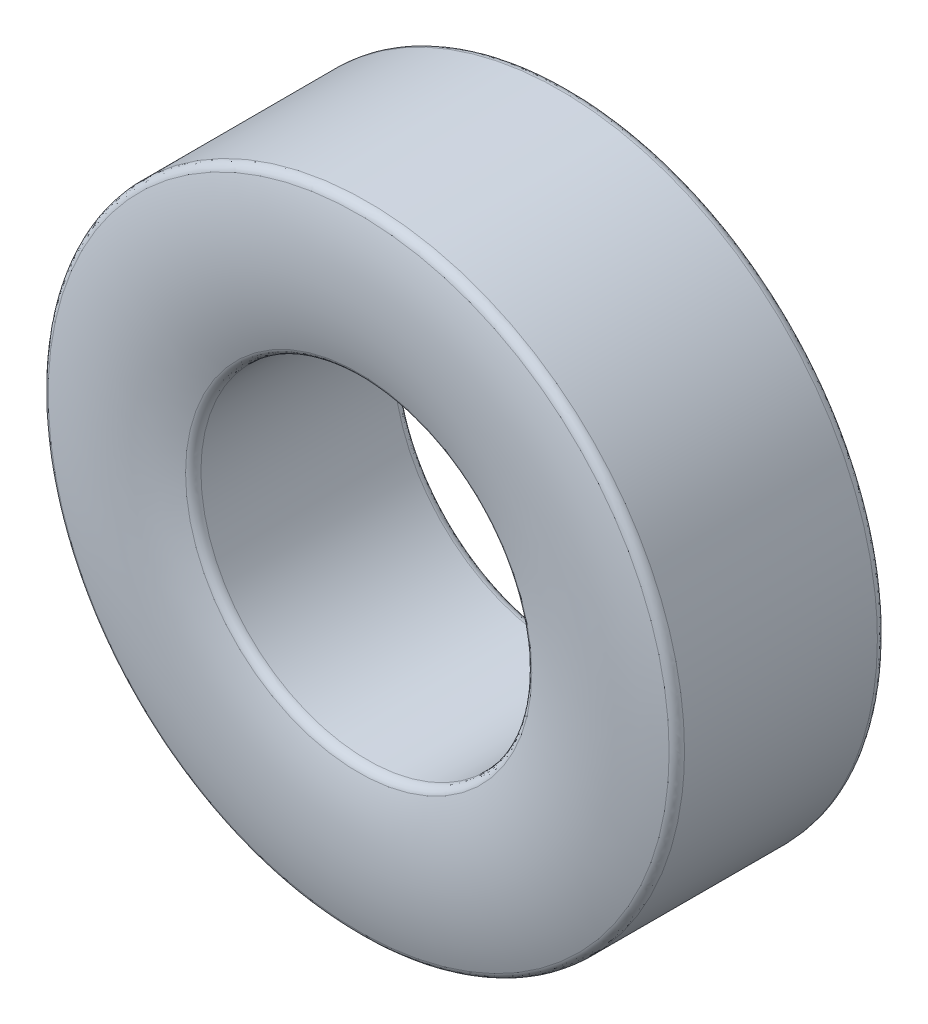
ISO-10303-21;
HEADER;
FILE_DESCRIPTION(('STEP AP214'),'2;1');
FILE_NAME('part.step','',(''),(''),'','','');
FILE_SCHEMA(('AUTOMOTIVE_DESIGN { 1 0 10303 214 1 1 1 1 }'));
ENDSEC;
DATA;
#1=APPLICATION_CONTEXT('core data for automotive mechanical design processes');
#2=APPLICATION_PROTOCOL_DEFINITION('international standard','automotive_design',2000,#1);
#3=PRODUCT_CONTEXT('',#1,'mechanical');
#4=PRODUCT('Part','Part','',(#3));
#5=PRODUCT_RELATED_PRODUCT_CATEGORY('part','',(#4));
#6=PRODUCT_DEFINITION_FORMATION('','',#4);
#7=PRODUCT_DEFINITION_CONTEXT('part definition',#1,'design');
#8=PRODUCT_DEFINITION('design','',#6,#7);
#9=PRODUCT_DEFINITION_SHAPE('','',#8);
#10=(LENGTH_UNIT() NAMED_UNIT(*) SI_UNIT(.MILLI.,.METRE.));
#11=(NAMED_UNIT(*) PLANE_ANGLE_UNIT() SI_UNIT($,.RADIAN.));
#12=(NAMED_UNIT(*) SI_UNIT($,.STERADIAN.) SOLID_ANGLE_UNIT());
#13=UNCERTAINTY_MEASURE_WITH_UNIT(LENGTH_MEASURE(1.E-05),#10,'distance_accuracy_value','');
#14=(GEOMETRIC_REPRESENTATION_CONTEXT(3) GLOBAL_UNCERTAINTY_ASSIGNED_CONTEXT((#13)) GLOBAL_UNIT_ASSIGNED_CONTEXT((#10,
#11,#12)) REPRESENTATION_CONTEXT('',''));
#15=CARTESIAN_POINT('',(0.,0.,0.));
#16=DIRECTION('',(0.,0.,1.));
#17=DIRECTION('',(1.,0.,0.));
#18=AXIS2_PLACEMENT_3D('',#15,#16,#17);
#19=CARTESIAN_POINT('',(41.4,17.7,22.357140159689));
#20=DIRECTION('',(0.,0.,-1.));
#21=DIRECTION('',(0.,1.,0.));
#22=AXIS2_PLACEMENT_3D('',#19,#20,#21);
#23=CYLINDRICAL_SURFACE('',#22,7.2);
#24=CARTESIAN_POINT('',(48.6,17.7,22.067196954359));
#25=CARTESIAN_POINT('',(48.6,14.515391342823,22.067196954359));
#26=CARTESIAN_POINT('',(47.083334745164,11.26299240056,22.067196954358));
#27=CARTESIAN_POINT('',(43.943052554538,8.790517808086,22.067196954359));
#28=CARTESIAN_POINT('',(39.65993358668,7.97768574266,22.067196954358));
#29=CARTESIAN_POINT('',(35.223114975667,9.586618152221,22.06719695436));
#30=CARTESIAN_POINT('',(32.246731902476,12.772196186467,22.067196954356));
#31=CARTESIAN_POINT('',(30.363843158455,17.6999999999,22.067196954361));
#32=CARTESIAN_POINT('',(32.246731902493,22.627803813708,22.067196954357));
#33=CARTESIAN_POINT('',(35.22311497565,25.813381847662,22.067196954359));
#34=CARTESIAN_POINT('',(39.659933586685,27.422314257403,22.067196954358));
#35=CARTESIAN_POINT('',(43.943052554541,26.609482191885,22.067196954359));
#36=CARTESIAN_POINT('',(47.08333474516,24.137007599452,22.067196954358));
#37=CARTESIAN_POINT('',(48.600000000001,20.884608657174,22.067196954359));
#38=CARTESIAN_POINT('',(48.6,17.7,22.067196954359));
#39=(BOUNDED_CURVE() B_SPLINE_CURVE(14,(#24,#25,#26,#27,#28,#29,#30,#31,#32,#33,#34,#35,#36,#37,
#38),.UNSPECIFIED.,.T.,.F.) B_SPLINE_CURVE_WITH_KNOTS((15,15),(0.,45.238934211693),
.UNSPECIFIED.) CURVE() GEOMETRIC_REPRESENTATION_ITEM() RATIONAL_B_SPLINE_CURVE((1.,1.,
0.999999999999,1.000000000001,0.999999999998,1.000000000003,0.999999999998,1.000000000001,
0.999999999999,1.,1.,1.,1.,1.,1.)) REPRESENTATION_ITEM(''));
#40=CARTESIAN_POINT('',(48.6,17.7,22.067196954359));
#41=VERTEX_POINT('',#40);
#42=EDGE_CURVE('E54',#41,#41,#39,.T.);
#43=ORIENTED_EDGE('',*,*,#42,.F.);
#44=EDGE_LOOP('',(#43));
#45=FACE_BOUND('',#44,.T.);
#46=CARTESIAN_POINT('',(48.6,17.7,13.732803045641));
#47=CARTESIAN_POINT('',(48.600000000004,20.884608657176,13.732803045641));
#48=CARTESIAN_POINT('',(47.083334745148,24.13700759944,13.732803045641));
#49=CARTESIAN_POINT('',(43.943052554562,26.609482191929,13.732803045641));
#50=CARTESIAN_POINT('',(39.659933586679,27.4223142573,13.732803045642));
#51=CARTESIAN_POINT('',(35.223114975597,25.81338184782,13.732803045641));
#52=CARTESIAN_POINT('',(32.246731902622,22.627803813541,13.732803045642));
#53=CARTESIAN_POINT('',(30.363843158271,17.699999999992,13.732803045641));
#54=CARTESIAN_POINT('',(32.246731902608,12.772196186473,13.732803045642));
#55=CARTESIAN_POINT('',(35.223114975616,9.586618152168,13.732803045641));
#56=CARTESIAN_POINT('',(39.659933586666,7.977685742708,13.732803045642));
#57=CARTESIAN_POINT('',(43.943052554566,8.790517808067,13.732803045641));
#58=CARTESIAN_POINT('',(47.083334745148,11.262992400562,13.732803045642));
#59=CARTESIAN_POINT('',(48.600000000005,14.515391342823,13.732803045641));
#60=CARTESIAN_POINT('',(48.6,17.7,13.732803045641));
#61=(BOUNDED_CURVE() B_SPLINE_CURVE(14,(#46,#47,#48,#49,#50,#51,#52,#53,#54,#55,#56,#57,#58,#59,
#60),.UNSPECIFIED.,.T.,.F.) B_SPLINE_CURVE_WITH_KNOTS((15,15),(0.,45.238934211693),
.UNSPECIFIED.) CURVE() GEOMETRIC_REPRESENTATION_ITEM() RATIONAL_B_SPLINE_CURVE((1.,1.,
1.000000000001,0.999999999996,1.000000000008,0.999999999987,1.000000000018,0.999999999981,
1.000000000017,0.999999999987,1.000000000007,0.999999999997,1.000000000001,1.,1.)) REPRESENTATION_ITEM(''));
#62=CARTESIAN_POINT('',(48.6,17.7,13.732803045641));
#63=VERTEX_POINT('',#62);
#64=EDGE_CURVE('E49',#63,#63,#61,.T.);
#65=ORIENTED_EDGE('',*,*,#64,.F.);
#66=EDGE_LOOP('',(#65));
#67=FACE_BOUND('',#66,.T.);
#68=ADVANCED_FACE('F15',(#45,#67),#23,.F.);
#69=CARTESIAN_POINT('',(48.88125,17.7,22.449163494123));
#70=CARTESIAN_POINT('',(48.88125,14.390992567152,22.449163494123));
#71=CARTESIAN_POINT('',(47.305340008648,11.011546791207,22.449163494124));
#72=CARTESIAN_POINT('',(44.042390544944,8.442491159962,22.449163494123));
#73=CARTESIAN_POINT('',(39.591962242421,7.597907841988,22.449163494124));
#74=CARTESIAN_POINT('',(34.981830404384,9.269689173783,22.449163494122));
#75=CARTESIAN_POINT('',(31.889182367445,12.579703850013,22.449163494125));
#76=CARTESIAN_POINT('',(29.9327432818,17.699999999883,22.449163494122));
#77=CARTESIAN_POINT('',(31.889182367463,22.820296150192,22.449163494125));
#78=CARTESIAN_POINT('',(34.981830404365,26.130310826078,22.449163494122));
#79=CARTESIAN_POINT('',(39.591962242427,27.802092158087,22.449163494124));
#80=CARTESIAN_POINT('',(44.042390544947,26.957508840003,22.449163494123));
#81=CARTESIAN_POINT('',(47.305340008645,24.388453208806,22.449163494124));
#82=CARTESIAN_POINT('',(48.881250000001,21.009007432845,22.449163494123));
#83=CARTESIAN_POINT('',(48.88125,17.7,22.449163494123));
#84=CARTESIAN_POINT('',(48.6,17.7,22.361725370563));
#85=CARTESIAN_POINT('',(48.600000000001,14.515391342824,22.361725370563));
#86=CARTESIAN_POINT('',(47.08333474516,11.262992400557,22.361725370563));
#87=CARTESIAN_POINT('',(43.943052554545,8.790517808091,22.361725370563));
#88=CARTESIAN_POINT('',(39.659933586675,7.977685742652,22.361725370563));
#89=CARTESIAN_POINT('',(35.223114975656,9.58661815224,22.361725370563));
#90=CARTESIAN_POINT('',(32.246731902512,12.77219618642,22.361725370562));
#91=CARTESIAN_POINT('',(30.3638431584,17.69999999999,22.361725370563));
#92=CARTESIAN_POINT('',(32.246731902531,22.627803813586,22.361725370563));
#93=CARTESIAN_POINT('',(35.223114975638,25.813381847775,22.361725370562));
#94=CARTESIAN_POINT('',(39.659933586676,27.422314257325,22.361725370563));
#95=CARTESIAN_POINT('',(43.943052554553,26.609482191922,22.361725370563));
#96=CARTESIAN_POINT('',(47.083334745154,24.13700759944,22.361725370563));
#97=CARTESIAN_POINT('',(48.600000000003,20.884608657176,22.361725370563));
#98=CARTESIAN_POINT('',(48.6,17.7,22.361725370563));
#99=CARTESIAN_POINT('',(48.6,17.7,22.067196954359));
#100=CARTESIAN_POINT('',(48.6,14.515391342823,22.067196954359));
#101=CARTESIAN_POINT('',(47.083334745164,11.26299240056,22.067196954358));
#102=CARTESIAN_POINT('',(43.943052554538,8.790517808086,22.067196954359));
#103=CARTESIAN_POINT('',(39.65993358668,7.97768574266,22.067196954358));
#104=CARTESIAN_POINT('',(35.223114975667,9.586618152221,22.06719695436));
#105=CARTESIAN_POINT('',(32.246731902476,12.772196186467,22.067196954356));
#106=CARTESIAN_POINT('',(30.363843158455,17.6999999999,22.067196954361));
#107=CARTESIAN_POINT('',(32.246731902493,22.627803813708,22.067196954357));
#108=CARTESIAN_POINT('',(35.22311497565,25.813381847662,22.067196954359));
#109=CARTESIAN_POINT('',(39.659933586685,27.422314257403,22.067196954358));
#110=CARTESIAN_POINT('',(43.943052554541,26.609482191885,22.067196954359));
#111=CARTESIAN_POINT('',(47.08333474516,24.137007599452,22.067196954358));
#112=CARTESIAN_POINT('',(48.600000000001,20.884608657174,22.067196954359));
#113=CARTESIAN_POINT('',(48.6,17.7,22.067196954359));
#114=(BOUNDED_SURFACE() B_SPLINE_SURFACE(2,14,((#69,#70,#71,#72,#73,#74,#75,#76,#77,#78,#79,#80,
#81,#82,#83),(#84,#85,#86,#87,#88,#89,#90,#91,#92,#93,#94,#95,#96,#97,#98),(#99,#100,#101,#102,
#103,#104,#105,#106,#107,#108,#109,#110,#111,#112,#113)),.UNSPECIFIED.,.F.,.T.,
.F.) B_SPLINE_SURFACE_WITH_KNOTS((3,3),(15,15),(0.,45.238934211693),(0.,45.238934211693),
.UNSPECIFIED.) GEOMETRIC_REPRESENTATION_ITEM() RATIONAL_B_SPLINE_SURFACE(((1.,1.,0.999999999999,
1.000000000001,0.999999999998,1.000000000003,0.999999999998,1.000000000001,0.999999999999,1.,1.,
1.,1.,1.,1.),(0.80525617042,0.80525617042,0.80525617042,0.805256170421,0.805256170421,
0.805256170419,0.805256170424,0.805256170415,0.805256170426,0.805256170416,0.805256170423,
0.805256170419,0.805256170421,0.80525617042,0.80525617042),(1.,1.,0.999999999999,1.000000000001,
0.999999999998,1.000000000003,0.999999999998,1.000000000001,0.999999999999,1.,1.,1.,1.,1.,1.))) REPRESENTATION_ITEM('') SURFACE());
#115=CARTESIAN_POINT('',(41.4,17.7,22.4491634941234));
#116=DIRECTION('',(0.,0.,-1.));
#117=DIRECTION('',(1.,0.,0.));
#118=AXIS2_PLACEMENT_3D('',#115,#116,#117);
#119=CIRCLE('',#118,7.48124999999987);
#120=CARTESIAN_POINT('',(48.8812499999999,17.7,22.4491634941234));
#121=VERTEX_POINT('',#120);
#122=EDGE_CURVE('E44',#121,#121,#119,.T.);
#123=ORIENTED_EDGE('',*,*,#42,.T.);
#124=EDGE_LOOP('',(#123));
#125=FACE_BOUND('',#124,.T.);
#126=ORIENTED_EDGE('',*,*,#122,.F.);
#127=EDGE_LOOP('',(#126));
#128=FACE_BOUND('',#127,.T.);
#129=ADVANCED_FACE('F62',(#125,#128),#114,.T.);
#130=CARTESIAN_POINT('',(48.6,17.7,13.732803045641));
#131=CARTESIAN_POINT('',(48.600000000005,14.515391342823,13.732803045641));
#132=CARTESIAN_POINT('',(47.083334745148,11.262992400562,13.732803045642));
#133=CARTESIAN_POINT('',(43.943052554566,8.790517808067,13.732803045641));
#134=CARTESIAN_POINT('',(39.659933586666,7.977685742708,13.732803045642));
#135=CARTESIAN_POINT('',(35.223114975616,9.586618152168,13.732803045641));
#136=CARTESIAN_POINT('',(32.246731902608,12.772196186473,13.732803045642));
#137=CARTESIAN_POINT('',(30.363843158271,17.699999999992,13.732803045641));
#138=CARTESIAN_POINT('',(32.246731902622,22.627803813541,13.732803045642));
#139=CARTESIAN_POINT('',(35.223114975597,25.81338184782,13.732803045641));
#140=CARTESIAN_POINT('',(39.659933586679,27.4223142573,13.732803045642));
#141=CARTESIAN_POINT('',(43.943052554562,26.609482191929,13.732803045641));
#142=CARTESIAN_POINT('',(47.083334745148,24.13700759944,13.732803045641));
#143=CARTESIAN_POINT('',(48.600000000004,20.884608657176,13.732803045641));
#144=CARTESIAN_POINT('',(48.6,17.7,13.732803045641));
#145=CARTESIAN_POINT('',(48.6,17.7,13.438274629437));
#146=CARTESIAN_POINT('',(48.600000000005,14.515391342823,13.438274629437));
#147=CARTESIAN_POINT('',(47.083334745147,11.262992400563,13.438274629437));
#148=CARTESIAN_POINT('',(43.943052554568,8.790517808064,13.438274629437));
#149=CARTESIAN_POINT('',(39.659933586666,7.977685742713,13.438274629437));
#150=CARTESIAN_POINT('',(35.223114975611,9.586618152163,13.438274629437));
#151=CARTESIAN_POINT('',(32.246731902618,12.772196186473,13.438274629437));
#152=CARTESIAN_POINT('',(30.363843158258,17.700000000004,13.438274629438));
#153=CARTESIAN_POINT('',(32.246731902628,22.627803813522,13.438274629437));
#154=CARTESIAN_POINT('',(35.223114975598,25.813381847838,13.438274629437));
#155=CARTESIAN_POINT('',(39.659933586674,27.422314257289,13.438274629437));
#156=CARTESIAN_POINT('',(43.943052554565,26.609482191933,13.438274629437));
#157=CARTESIAN_POINT('',(47.083334745147,24.137007599439,13.438274629437));
#158=CARTESIAN_POINT('',(48.600000000005,20.884608657176,13.438274629437));
#159=CARTESIAN_POINT('',(48.6,17.7,13.438274629437));
#160=CARTESIAN_POINT('',(48.88125,17.7,13.350836505877));
#161=CARTESIAN_POINT('',(48.881250000005,14.390992567153,13.350836505877));
#162=CARTESIAN_POINT('',(47.30534000863,11.011546791207,13.350836505877));
#163=CARTESIAN_POINT('',(44.04239054498,8.442491159952,13.350836505877));
#164=CARTESIAN_POINT('',(39.591962242392,7.597907842018,13.350836505876));
#165=CARTESIAN_POINT('',(34.981830404359,9.269689173759,13.350836505877));
#166=CARTESIAN_POINT('',(31.889182367541,12.579703849981,13.350836505876));
#167=CARTESIAN_POINT('',(29.932743281657,17.70000000002,13.350836505877));
#168=CARTESIAN_POINT('',(31.889182367553,22.820296149983,13.350836505876));
#169=CARTESIAN_POINT('',(34.981830404344,26.130310826269,13.350836505877));
#170=CARTESIAN_POINT('',(39.5919622424,27.802092157964,13.350836505876));
#171=CARTESIAN_POINT('',(44.042390544979,26.957508840056,13.350836505877));
#172=CARTESIAN_POINT('',(47.305340008629,24.388453208791,13.350836505877));
#173=CARTESIAN_POINT('',(48.881250000005,21.009007432847,13.350836505877));
#174=CARTESIAN_POINT('',(48.88125,17.7,13.350836505877));
#175=(BOUNDED_SURFACE() B_SPLINE_SURFACE(2,14,((#130,#131,#132,#133,#134,#135,#136,#137,#138,
#139,#140,#141,#142,#143,#144),(#145,#146,#147,#148,#149,#150,#151,#152,#153,#154,#155,#156,
#157,#158,#159),(#160,#161,#162,#163,#164,#165,#166,#167,#168,#169,#170,#171,#172,#173,#174)),
.UNSPECIFIED.,.F.,.T.,.F.) B_SPLINE_SURFACE_WITH_KNOTS((3,3),(15,15),(0.,45.238934211693),(0.,
45.238934211693),.UNSPECIFIED.) GEOMETRIC_REPRESENTATION_ITEM() RATIONAL_B_SPLINE_SURFACE(((1.,
1.,1.000000000001,0.999999999997,1.000000000007,0.999999999987,1.000000000017,0.999999999981,
1.000000000018,0.999999999987,1.000000000008,0.999999999996,1.000000000001,1.,1.),
(0.80525617042,0.80525617042,0.805256170421,0.805256170417,0.805256170427,0.805256170409,
0.805256170436,0.805256170403,0.805256170436,0.805256170409,0.805256170427,0.805256170417,
0.805256170421,0.80525617042,0.80525617042),(1.,1.,1.000000000001,0.999999999997,1.000000000007,
0.999999999987,1.000000000017,0.999999999981,1.000000000018,0.999999999987,1.000000000008,
0.999999999996,1.000000000001,1.,1.))) REPRESENTATION_ITEM('') SURFACE());
#176=CARTESIAN_POINT('',(41.4,17.7,13.3508365058766));
#177=DIRECTION('',(0.,0.,1.));
#178=DIRECTION('',(1.,0.,0.));
#179=AXIS2_PLACEMENT_3D('',#176,#177,#178);
#180=CIRCLE('',#179,7.48124999999988);
#181=CARTESIAN_POINT('',(48.8812499999999,17.7,13.3508365058766));
#182=VERTEX_POINT('',#181);
#183=EDGE_CURVE('E39',#182,#182,#180,.T.);
#184=ORIENTED_EDGE('',*,*,#183,.F.);
#185=EDGE_LOOP('',(#184));
#186=FACE_BOUND('',#185,.T.);
#187=ORIENTED_EDGE('',*,*,#64,.T.);
#188=EDGE_LOOP('',(#187));
#189=FACE_BOUND('',#188,.T.);
#190=ADVANCED_FACE('F82',(#186,#189),#175,.T.);
#191=CARTESIAN_POINT('',(41.4,17.7,12.9));
#192=DIRECTION('',(0.,0.,1.));
#193=DIRECTION('',(1.,0.,0.));
#194=AXIS2_PLACEMENT_3D('',#191,#192,#193);
#195=TOROIDAL_SURFACE('',#194,10.45,10.);
#196=CARTESIAN_POINT('',(41.4,17.7,22.4491634941234));
#197=DIRECTION('',(0.,0.,1.));
#198=DIRECTION('',(1.,0.,0.));
#199=AXIS2_PLACEMENT_3D('',#196,#197,#198);
#200=CIRCLE('',#199,13.4187500000001);
#201=CARTESIAN_POINT('',(54.8187500000001,17.7,22.4491634941234));
#202=VERTEX_POINT('',#201);
#203=EDGE_CURVE('E34',#202,#202,#200,.T.);
#204=ORIENTED_EDGE('',*,*,#203,.T.);
#205=EDGE_LOOP('',(#204));
#206=FACE_BOUND('',#205,.T.);
#207=ORIENTED_EDGE('',*,*,#122,.T.);
#208=EDGE_LOOP('',(#207));
#209=FACE_BOUND('',#208,.T.);
#210=ADVANCED_FACE('F196',(#206,#209),#195,.T.);
#211=CARTESIAN_POINT('',(41.4,17.7,22.9));
#212=DIRECTION('',(0.,0.,1.));
#213=DIRECTION('',(1.,0.,0.));
#214=AXIS2_PLACEMENT_3D('',#211,#212,#213);
#215=TOROIDAL_SURFACE('',#214,10.45,10.);
#216=ORIENTED_EDGE('',*,*,#183,.T.);
#217=EDGE_LOOP('',(#216));
#218=FACE_BOUND('',#217,.T.);
#219=CARTESIAN_POINT('',(54.81875,17.7,13.350836505877));
#220=CARTESIAN_POINT('',(54.818749999993,23.635203808118,13.350836505877));
#221=CARTESIAN_POINT('',(51.992117793323,29.696749406285,13.350836505876));
#222=CARTESIAN_POINT('',(46.139525897992,34.304738078042,13.350836505877));
#223=CARTESIAN_POINT('',(38.157011641297,35.819625617024,13.350836505876));
#224=CARTESIAN_POINT('',(29.888045010929,32.821033703729,13.350836505877));
#225=CARTESIAN_POINT('',(24.340914405122,26.884023253658,13.350836505877));
#226=CARTESIAN_POINT('',(20.831745886495,17.69999999984,13.350836505876));
#227=CARTESIAN_POINT('',(24.340914405092,8.515976746612,13.350836505877));
#228=CARTESIAN_POINT('',(29.888045010952,2.578966296104,13.350836505877));
#229=CARTESIAN_POINT('',(38.157011641303,-0.419625616945,13.350836505876));
#230=CARTESIAN_POINT('',(46.139525897974,1.095261921922,13.350836505877));
#231=CARTESIAN_POINT('',(51.992117793335,5.70325059373,13.350836505876));
#232=CARTESIAN_POINT('',(54.81874999999,11.764796191878,13.350836505877));
#233=CARTESIAN_POINT('',(54.81875,17.7,13.350836505877));
#234=(BOUNDED_CURVE() B_SPLINE_CURVE(14,(#219,#220,#221,#222,#223,#224,#225,#226,#227,#228,#229,
#230,#231,#232,#233),.UNSPECIFIED.,.T.,.F.) B_SPLINE_CURVE_WITH_KNOTS((15,15),(0.,
86.079638708359),
.UNSPECIFIED.) CURVE() GEOMETRIC_REPRESENTATION_ITEM() RATIONAL_B_SPLINE_CURVE((1.,1.,
0.999999999999,1.000000000004,0.999999999992,1.000000000015,0.999999999979,1.000000000024,
0.999999999977,1.000000000018,0.999999999988,1.000000000006,0.999999999998,1.,1.)) REPRESENTATION_ITEM(''));
#235=CARTESIAN_POINT('',(54.81875,17.7,13.350836505877));
#236=VERTEX_POINT('',#235);
#237=EDGE_CURVE('E29',#236,#236,#234,.T.);
#238=ORIENTED_EDGE('',*,*,#237,.F.);
#239=EDGE_LOOP('',(#238));
#240=FACE_BOUND('',#239,.T.);
#241=ADVANCED_FACE('F174',(#218,#240),#215,.T.);
#242=CARTESIAN_POINT('',(54.81875,17.7,22.449163494123));
#243=CARTESIAN_POINT('',(54.818749999992,11.76479619188,22.449163494123));
#244=CARTESIAN_POINT('',(51.992117793329,5.703250593726,22.449163494124));
#245=CARTESIAN_POINT('',(46.139525897974,1.095261921927,22.449163494123));
#246=CARTESIAN_POINT('',(38.157011641335,-0.419625616959,22.449163494124));
#247=CARTESIAN_POINT('',(29.888045010868,2.578966296153,22.449163494124));
#248=CARTESIAN_POINT('',(24.340914405207,8.515976746522,22.449163494123));
#249=CARTESIAN_POINT('',(20.831745886383,17.699999999941,22.449163494124));
#250=CARTESIAN_POINT('',(24.340914405208,26.884023253585,22.449163494123));
#251=CARTESIAN_POINT('',(29.888045010869,32.821033703763,22.449163494123));
#252=CARTESIAN_POINT('',(38.157011641333,35.819625617017,22.449163494124));
#253=CARTESIAN_POINT('',(46.139525897975,34.304738078041,22.449163494123));
#254=CARTESIAN_POINT('',(51.992117793328,29.696749406287,22.449163494123));
#255=CARTESIAN_POINT('',(54.818749999992,23.635203808117,22.449163494123));
#256=CARTESIAN_POINT('',(54.81875,17.7,22.449163494123));
#257=CARTESIAN_POINT('',(55.1,17.7,22.361725370563));
#258=CARTESIAN_POINT('',(55.099999999994,11.640397416209,22.361725370563));
#259=CARTESIAN_POINT('',(52.2141230568,5.451804984374,22.361725370563));
#260=CARTESIAN_POINT('',(46.238863888416,0.747235273798,22.361725370563));
#261=CARTESIAN_POINT('',(38.08904029701,-0.79940351762,22.361725370563));
#262=CARTESIAN_POINT('',(29.646760439682,2.262037317704,22.361725370563));
#263=CARTESIAN_POINT('',(23.983364870053,8.323484410066,22.361725370563));
#264=CARTESIAN_POINT('',(20.400646009861,17.699999999952,22.361725370562));
#265=CARTESIAN_POINT('',(23.983364870045,27.076515590027,22.361725370563));
#266=CARTESIAN_POINT('',(29.646760439693,33.137962682216,22.361725370562));
#267=CARTESIAN_POINT('',(38.089040297003,36.199403517679,22.361725370563));
#268=CARTESIAN_POINT('',(46.238863888418,34.652764726168,22.361725370563));
#269=CARTESIAN_POINT('',(52.2141230568,29.948195015639,22.361725370563));
#270=CARTESIAN_POINT('',(55.099999999994,23.759602583788,22.361725370563));
#271=CARTESIAN_POINT('',(55.1,17.7,22.361725370563));
#272=CARTESIAN_POINT('',(55.1,17.7,22.067196954359));
#273=CARTESIAN_POINT('',(55.099999999994,11.640397416208,22.067196954359));
#274=CARTESIAN_POINT('',(52.214123056801,5.451804984376,22.067196954358));
#275=CARTESIAN_POINT('',(46.238863888417,0.747235273796,22.067196954359));
#276=CARTESIAN_POINT('',(38.089040296995,-0.799403517618,22.067196954358));
#277=CARTESIAN_POINT('',(29.646760439728,2.262037317691,22.067196954359));
#278=CARTESIAN_POINT('',(23.983364869975,8.323484410107,22.067196954359));
#279=CARTESIAN_POINT('',(20.400646009957,17.699999999872,22.067196954357));
#280=CARTESIAN_POINT('',(23.983364869968,27.076515590127,22.06719695436));
#281=CARTESIAN_POINT('',(29.64676043974,33.13796268213,22.067196954357));
#282=CARTESIAN_POINT('',(38.089040296982,36.199403517734,22.067196954359));
#283=CARTESIAN_POINT('',(46.238863888425,34.652764726142,22.067196954358));
#284=CARTESIAN_POINT('',(52.214123056798,29.948195015647,22.067196954358));
#285=CARTESIAN_POINT('',(55.099999999995,23.759602583786,22.067196954359));
#286=CARTESIAN_POINT('',(55.1,17.7,22.067196954359));
#287=(BOUNDED_SURFACE() B_SPLINE_SURFACE(2,14,((#242,#243,#244,#245,#246,#247,#248,#249,#250,
#251,#252,#253,#254,#255,#256),(#257,#258,#259,#260,#261,#262,#263,#264,#265,#266,#267,#268,
#269,#270,#271),(#272,#273,#274,#275,#276,#277,#278,#279,#280,#281,#282,#283,#284,#285,#286)),
.UNSPECIFIED.,.F.,.T.,.F.) B_SPLINE_SURFACE_WITH_KNOTS((3,3),(15,15),(0.,86.07963870836),(0.,
86.07963870836),.UNSPECIFIED.) GEOMETRIC_REPRESENTATION_ITEM() RATIONAL_B_SPLINE_SURFACE(((1.,
1.,0.999999999999,1.000000000004,0.999999999991,1.000000000015,0.999999999979,1.000000000023,
0.999999999979,1.000000000015,0.999999999991,1.000000000004,0.999999999999,1.,1.),
(0.80525617042,0.805256170421,0.805256170419,0.805256170423,0.805256170414,0.805256170431,
0.805256170406,0.805256170437,0.805256170406,0.805256170431,0.805256170414,0.805256170423,
0.805256170419,0.805256170421,0.80525617042),(1.,1.,0.999999999999,1.000000000004,
0.999999999991,1.000000000015,0.999999999979,1.000000000023,0.999999999979,1.000000000015,
0.999999999991,1.000000000004,0.999999999999,1.,1.))) REPRESENTATION_ITEM('') SURFACE());
#288=CARTESIAN_POINT('',(55.1,17.7,22.067196954359));
#289=CARTESIAN_POINT('',(55.099999999995,23.759602583786,22.067196954359));
#290=CARTESIAN_POINT('',(52.214123056798,29.948195015647,22.067196954358));
#291=CARTESIAN_POINT('',(46.238863888425,34.652764726142,22.067196954358));
#292=CARTESIAN_POINT('',(38.089040296982,36.199403517734,22.067196954359));
#293=CARTESIAN_POINT('',(29.64676043974,33.13796268213,22.067196954357));
#294=CARTESIAN_POINT('',(23.983364869968,27.076515590127,22.06719695436));
#295=CARTESIAN_POINT('',(20.400646009957,17.699999999872,22.067196954357));
#296=CARTESIAN_POINT('',(23.983364869975,8.323484410107,22.067196954359));
#297=CARTESIAN_POINT('',(29.646760439728,2.262037317691,22.067196954359));
#298=CARTESIAN_POINT('',(38.089040296995,-0.799403517618,22.067196954358));
#299=CARTESIAN_POINT('',(46.238863888417,0.747235273796,22.067196954359));
#300=CARTESIAN_POINT('',(52.214123056801,5.451804984376,22.067196954358));
#301=CARTESIAN_POINT('',(55.099999999994,11.640397416208,22.067196954359));
#302=CARTESIAN_POINT('',(55.1,17.7,22.067196954359));
#303=(BOUNDED_CURVE() B_SPLINE_CURVE(14,(#288,#289,#290,#291,#292,#293,#294,#295,#296,#297,#298,
#299,#300,#301,#302),.UNSPECIFIED.,.T.,.F.) B_SPLINE_CURVE_WITH_KNOTS((15,15),(0.,
86.07963870836),
.UNSPECIFIED.) CURVE() GEOMETRIC_REPRESENTATION_ITEM() RATIONAL_B_SPLINE_CURVE((1.,1.,
0.999999999999,1.000000000004,0.999999999991,1.000000000015,0.999999999979,1.000000000023,
0.999999999979,1.000000000015,0.999999999991,1.000000000004,0.999999999999,1.,1.)) REPRESENTATION_ITEM(''));
#304=CARTESIAN_POINT('',(55.1,17.7,22.067196954359));
#305=VERTEX_POINT('',#304);
#306=EDGE_CURVE('E24',#305,#305,#303,.F.);
#307=ORIENTED_EDGE('',*,*,#306,.F.);
#308=EDGE_LOOP('',(#307));
#309=FACE_BOUND('',#308,.T.);
#310=ORIENTED_EDGE('',*,*,#203,.F.);
#311=EDGE_LOOP('',(#310));
#312=FACE_BOUND('',#311,.T.);
#313=ADVANCED_FACE('F123',(#309,#312),#287,.F.);
#314=CARTESIAN_POINT('',(54.81875,17.7,13.350836505877));
#315=CARTESIAN_POINT('',(54.81874999999,11.764796191878,13.350836505877));
#316=CARTESIAN_POINT('',(51.992117793335,5.70325059373,13.350836505876));
#317=CARTESIAN_POINT('',(46.139525897974,1.095261921922,13.350836505877));
#318=CARTESIAN_POINT('',(38.157011641303,-0.419625616945,13.350836505876));
#319=CARTESIAN_POINT('',(29.888045010952,2.578966296104,13.350836505877));
#320=CARTESIAN_POINT('',(24.340914405092,8.515976746612,13.350836505877));
#321=CARTESIAN_POINT('',(20.831745886495,17.69999999984,13.350836505876));
#322=CARTESIAN_POINT('',(24.340914405122,26.884023253658,13.350836505877));
#323=CARTESIAN_POINT('',(29.888045010929,32.821033703729,13.350836505877));
#324=CARTESIAN_POINT('',(38.157011641297,35.819625617024,13.350836505876));
#325=CARTESIAN_POINT('',(46.139525897992,34.304738078042,13.350836505877));
#326=CARTESIAN_POINT('',(51.992117793323,29.696749406285,13.350836505876));
#327=CARTESIAN_POINT('',(54.818749999993,23.635203808118,13.350836505877));
#328=CARTESIAN_POINT('',(54.81875,17.7,13.350836505877));
#329=CARTESIAN_POINT('',(55.1,17.7,13.438274629437));
#330=CARTESIAN_POINT('',(55.099999999996,11.640397416206,13.438274629437));
#331=CARTESIAN_POINT('',(52.214123056791,5.451804984385,13.438274629437));
#332=CARTESIAN_POINT('',(46.238863888452,0.74723527377,13.438274629437));
#333=CARTESIAN_POINT('',(38.089040296922,-0.799403517553,13.438274629437));
#334=CARTESIAN_POINT('',(29.64676043982,2.262037317576,13.438274629438));
#335=CARTESIAN_POINT('',(23.983364869909,8.323484410231,13.438274629437));
#336=CARTESIAN_POINT('',(20.400646009965,17.699999999831,13.438274629438));
#337=CARTESIAN_POINT('',(23.983364869956,27.076515590045,13.438274629437));
#338=CARTESIAN_POINT('',(29.646760439779,33.137962682267,13.438274629438));
#339=CARTESIAN_POINT('',(38.089040296921,36.199403517617,13.438274629437));
#340=CARTESIAN_POINT('',(46.238863888472,34.652764726203,13.438274629437));
#341=CARTESIAN_POINT('',(52.214123056776,29.948195015628,13.438274629437));
#342=CARTESIAN_POINT('',(55.1,23.75960258379,13.438274629437));
#343=CARTESIAN_POINT('',(55.1,17.7,13.438274629437));
#344=CARTESIAN_POINT('',(55.1,17.7,13.732803045641));
#345=CARTESIAN_POINT('',(55.099999999993,11.640397416205,13.732803045641));
#346=CARTESIAN_POINT('',(52.2141230568,5.451804984386,13.732803045642));
#347=CARTESIAN_POINT('',(46.238863888436,0.747235273774,13.732803045641));
#348=CARTESIAN_POINT('',(38.089040296923,-0.799403517569,13.732803045643));
#349=CARTESIAN_POINT('',(29.646760439874,2.262037317587,13.732803045639));
#350=CARTESIAN_POINT('',(23.983364869779,8.323484410267,13.732803045644));
#351=CARTESIAN_POINT('',(20.400646010155,17.699999999695,13.732803045639));
#352=CARTESIAN_POINT('',(23.983364869805,27.076515590266,13.732803045644));
#353=CARTESIAN_POINT('',(29.646760439859,33.137962682048,13.73280304564));
#354=CARTESIAN_POINT('',(38.089040296908,36.19940351777,13.732803045642));
#355=CARTESIAN_POINT('',(46.238863888461,34.65276472613,13.732803045641));
#356=CARTESIAN_POINT('',(52.214123056785,29.94819501565,13.732803045642));
#357=CARTESIAN_POINT('',(55.099999999997,23.759602583786,13.732803045641));
#358=CARTESIAN_POINT('',(55.1,17.7,13.732803045641));
#359=(BOUNDED_SURFACE() B_SPLINE_SURFACE(2,14,((#314,#315,#316,#317,#318,#319,#320,#321,#322,
#323,#324,#325,#326,#327,#328),(#329,#330,#331,#332,#333,#334,#335,#336,#337,#338,#339,#340,
#341,#342,#343),(#344,#345,#346,#347,#348,#349,#350,#351,#352,#353,#354,#355,#356,#357,#358)),
.UNSPECIFIED.,.F.,.T.,.F.) B_SPLINE_SURFACE_WITH_KNOTS((3,3),(15,15),(0.,86.079638708359),(0.,
86.079638708359),.UNSPECIFIED.) GEOMETRIC_REPRESENTATION_ITEM() RATIONAL_B_SPLINE_SURFACE(((1.,
1.,0.999999999998,1.000000000006,0.999999999988,1.000000000018,0.999999999977,1.000000000024,
0.999999999979,1.000000000015,0.999999999992,1.000000000004,0.999999999999,1.,1.),
(0.80525617042,0.805256170421,0.805256170419,0.805256170424,0.805256170414,0.80525617043,
0.805256170409,0.805256170431,0.805256170412,0.805256170426,0.805256170417,0.805256170422,
0.80525617042,0.80525617042,0.80525617042),(1.,1.,0.999999999998,1.000000000006,0.999999999988,
1.000000000018,0.999999999977,1.000000000024,0.999999999979,1.000000000015,0.999999999992,
1.000000000004,0.999999999999,1.,1.))) REPRESENTATION_ITEM('') SURFACE());
#360=CARTESIAN_POINT('',(55.1,17.7,13.732803045641));
#361=CARTESIAN_POINT('',(55.099999999993,11.640397416205,13.732803045641));
#362=CARTESIAN_POINT('',(52.2141230568,5.451804984386,13.732803045642));
#363=CARTESIAN_POINT('',(46.238863888436,0.747235273774,13.732803045641));
#364=CARTESIAN_POINT('',(38.089040296923,-0.799403517569,13.732803045643));
#365=CARTESIAN_POINT('',(29.646760439874,2.262037317587,13.732803045639));
#366=CARTESIAN_POINT('',(23.983364869779,8.323484410267,13.732803045644));
#367=CARTESIAN_POINT('',(20.400646010155,17.699999999695,13.732803045639));
#368=CARTESIAN_POINT('',(23.983364869805,27.076515590266,13.732803045644));
#369=CARTESIAN_POINT('',(29.646760439859,33.137962682048,13.73280304564));
#370=CARTESIAN_POINT('',(38.089040296908,36.19940351777,13.732803045642));
#371=CARTESIAN_POINT('',(46.238863888461,34.65276472613,13.732803045641));
#372=CARTESIAN_POINT('',(52.214123056785,29.94819501565,13.732803045642));
#373=CARTESIAN_POINT('',(55.099999999997,23.759602583786,13.732803045641));
#374=CARTESIAN_POINT('',(55.1,17.7,13.732803045641));
#375=(BOUNDED_CURVE() B_SPLINE_CURVE(14,(#360,#361,#362,#363,#364,#365,#366,#367,#368,#369,#370,
#371,#372,#373,#374),.UNSPECIFIED.,.T.,.F.) B_SPLINE_CURVE_WITH_KNOTS((15,15),(0.,
86.079638708359),
.UNSPECIFIED.) CURVE() GEOMETRIC_REPRESENTATION_ITEM() RATIONAL_B_SPLINE_CURVE((1.,1.,
0.999999999998,1.000000000006,0.999999999988,1.000000000018,0.999999999977,1.000000000024,
0.999999999979,1.000000000015,0.999999999992,1.000000000004,0.999999999999,1.,1.)) REPRESENTATION_ITEM(''));
#376=CARTESIAN_POINT('',(55.1,17.7,13.732803045641));
#377=VERTEX_POINT('',#376);
#378=EDGE_CURVE('E10',#377,#377,#375,.F.);
#379=ORIENTED_EDGE('',*,*,#378,.F.);
#380=EDGE_LOOP('',(#379));
#381=FACE_BOUND('',#380,.T.);
#382=ORIENTED_EDGE('',*,*,#237,.T.);
#383=EDGE_LOOP('',(#382));
#384=FACE_BOUND('',#383,.T.);
#385=ADVANCED_FACE('F118',(#381,#384),#359,.T.);
#386=CARTESIAN_POINT('',(41.4,17.7,22.357140159689));
#387=DIRECTION('',(0.,0.,-1.));
#388=DIRECTION('',(0.,1.,0.));
#389=AXIS2_PLACEMENT_3D('',#386,#387,#388);
#390=CYLINDRICAL_SURFACE('',#389,13.7);
#391=ORIENTED_EDGE('',*,*,#306,.T.);
#392=EDGE_LOOP('',(#391));
#393=FACE_BOUND('',#392,.T.);
#394=ORIENTED_EDGE('',*,*,#378,.T.);
#395=EDGE_LOOP('',(#394));
#396=FACE_BOUND('',#395,.T.);
#397=ADVANCED_FACE('F116',(#393,#396),#390,.T.);
#398=CLOSED_SHELL('',(#68,#129,#190,#210,#241,#313,#385,#397));
#399=MANIFOLD_SOLID_BREP('B1',#398);
#400=ADVANCED_BREP_SHAPE_REPRESENTATION('',(#18,#399),#14);
#401=SHAPE_DEFINITION_REPRESENTATION(#9,#400);
ENDSEC;
END-ISO-10303-21;
